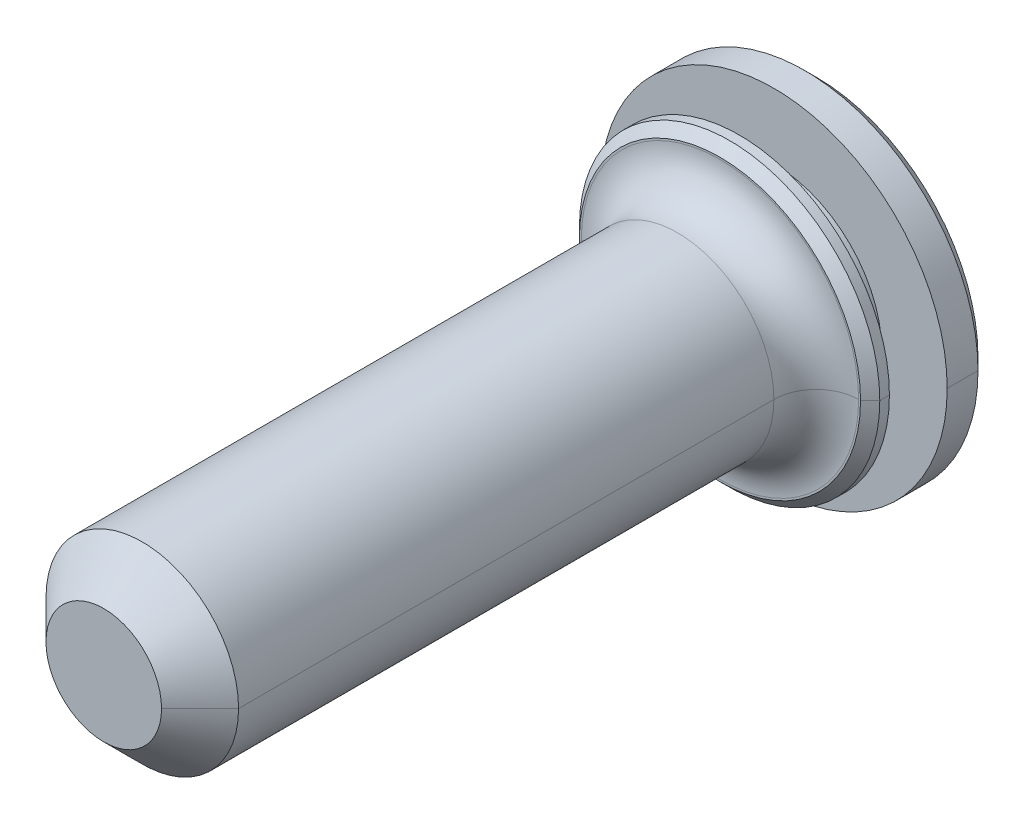
ISO-10303-21;
HEADER;
FILE_DESCRIPTION(('STEP AP214'),'2;1');
FILE_NAME('part.step','',(''),(''),'','','');
FILE_SCHEMA(('AUTOMOTIVE_DESIGN { 1 0 10303 214 1 1 1 1 }'));
ENDSEC;
DATA;
#1=APPLICATION_CONTEXT('core data for automotive mechanical design processes');
#2=APPLICATION_PROTOCOL_DEFINITION('international standard','automotive_design',2000,#1);
#3=PRODUCT_CONTEXT('',#1,'mechanical');
#4=PRODUCT('Part','Part','',(#3));
#5=PRODUCT_RELATED_PRODUCT_CATEGORY('part','',(#4));
#6=PRODUCT_DEFINITION_FORMATION('','',#4);
#7=PRODUCT_DEFINITION_CONTEXT('part definition',#1,'design');
#8=PRODUCT_DEFINITION('design','',#6,#7);
#9=PRODUCT_DEFINITION_SHAPE('','',#8);
#10=(LENGTH_UNIT() NAMED_UNIT(*) SI_UNIT(.MILLI.,.METRE.));
#11=(NAMED_UNIT(*) PLANE_ANGLE_UNIT() SI_UNIT($,.RADIAN.));
#12=(NAMED_UNIT(*) SI_UNIT($,.STERADIAN.) SOLID_ANGLE_UNIT());
#13=UNCERTAINTY_MEASURE_WITH_UNIT(LENGTH_MEASURE(1.E-05),#10,'distance_accuracy_value','');
#14=(GEOMETRIC_REPRESENTATION_CONTEXT(3) GLOBAL_UNCERTAINTY_ASSIGNED_CONTEXT((#13)) GLOBAL_UNIT_ASSIGNED_CONTEXT((#10,
#11,#12)) REPRESENTATION_CONTEXT('',''));
#15=CARTESIAN_POINT('',(0.,0.,0.));
#16=DIRECTION('',(0.,0.,1.));
#17=DIRECTION('',(1.,0.,0.));
#18=AXIS2_PLACEMENT_3D('',#15,#16,#17);
#19=CARTESIAN_POINT('',(-1.5,0.,18.5));
#20=CARTESIAN_POINT('',(-2.5,0.,17.5));
#21=(BOUNDED_CURVE() B_SPLINE_CURVE(1,(#19,#20),.UNSPECIFIED.,.F.,
.F.) B_SPLINE_CURVE_WITH_KNOTS((2,2),(0.,1.),
.UNSPECIFIED.) CURVE() GEOMETRIC_REPRESENTATION_ITEM() RATIONAL_B_SPLINE_CURVE((1.,1.)) REPRESENTATION_ITEM(''));
#22=CARTESIAN_POINT('',(0.,0.,18.5));
#23=DIRECTION('',(0.,0.,-1.));
#24=AXIS1_PLACEMENT('',#22,#23);
#25=SURFACE_OF_REVOLUTION('',#21,#24);
#26=CARTESIAN_POINT('',(0.,0.,17.5));
#27=DIRECTION('',(0.,0.,-1.));
#28=DIRECTION('',(-1.,0.,0.));
#29=AXIS2_PLACEMENT_3D('',#26,#27,#28);
#30=CIRCLE('',#29,2.5);
#31=CARTESIAN_POINT('',(-2.5,0.,17.5));
#32=VERTEX_POINT('',#31);
#33=CARTESIAN_POINT('',(2.5,0.,17.5));
#34=VERTEX_POINT('',#33);
#35=EDGE_CURVE('E224',#32,#34,#30,.T.);
#36=ORIENTED_EDGE('',*,*,#35,.F.);
#37=DIRECTION('',(0.707106781186548,0.,0.707106781186548));
#38=VECTOR('',#37,1.);
#39=CARTESIAN_POINT('',(-2.5,0.,17.5));
#40=LINE('',#39,#38);
#41=CARTESIAN_POINT('',(-1.5,0.,18.5));
#42=VERTEX_POINT('',#41);
#43=EDGE_CURVE('E220',#32,#42,#40,.T.);
#44=ORIENTED_EDGE('',*,*,#43,.T.);
#45=CARTESIAN_POINT('',(0.,0.,18.5));
#46=DIRECTION('',(0.,0.,-1.));
#47=DIRECTION('',(-1.,0.,0.));
#48=AXIS2_PLACEMENT_3D('',#45,#46,#47);
#49=CIRCLE('',#48,1.5);
#50=CARTESIAN_POINT('',(1.5,0.,18.5));
#51=VERTEX_POINT('',#50);
#52=EDGE_CURVE('E28',#42,#51,#49,.T.);
#53=ORIENTED_EDGE('',*,*,#52,.T.);
#54=DIRECTION('',(0.707106781186548,0.,-0.707106781186548));
#55=VECTOR('',#54,1.);
#56=CARTESIAN_POINT('',(1.5,0.,18.5));
#57=LINE('',#56,#55);
#58=EDGE_CURVE('E215',#51,#34,#57,.T.);
#59=ORIENTED_EDGE('',*,*,#58,.T.);
#60=EDGE_LOOP('',(#36,#44,#53,#59));
#61=FACE_BOUND('',#60,.T.);
#62=ADVANCED_FACE('F17',(#61),#25,.T.);
#63=CARTESIAN_POINT('',(2.5,0.,17.5));
#64=CARTESIAN_POINT('',(2.5,0.,3.6));
#65=(BOUNDED_CURVE() B_SPLINE_CURVE(1,(#63,#64),.UNSPECIFIED.,.F.,
.F.) B_SPLINE_CURVE_WITH_KNOTS((2,2),(0.,1.),
.UNSPECIFIED.) CURVE() GEOMETRIC_REPRESENTATION_ITEM() RATIONAL_B_SPLINE_CURVE((1.,1.)) REPRESENTATION_ITEM(''));
#66=CARTESIAN_POINT('',(0.,0.,17.5));
#67=DIRECTION('',(0.,0.,-1.));
#68=AXIS1_PLACEMENT('',#66,#67);
#69=SURFACE_OF_REVOLUTION('',#65,#68);
#70=CARTESIAN_POINT('',(0.,0.,17.5));
#71=DIRECTION('',(0.,0.,-1.));
#72=DIRECTION('',(1.,0.,0.));
#73=AXIS2_PLACEMENT_3D('',#70,#71,#72);
#74=CIRCLE('',#73,2.5);
#75=EDGE_CURVE('E223',#34,#32,#74,.T.);
#76=ORIENTED_EDGE('',*,*,#75,.T.);
#77=DIRECTION('',(0.,0.,1.));
#78=VECTOR('',#77,1.);
#79=CARTESIAN_POINT('',(-2.5,0.,3.6));
#80=LINE('',#79,#78);
#81=CARTESIAN_POINT('',(-2.5,0.,3.6));
#82=VERTEX_POINT('',#81);
#83=EDGE_CURVE('E183',#82,#32,#80,.T.);
#84=ORIENTED_EDGE('',*,*,#83,.F.);
#85=CARTESIAN_POINT('',(0.,0.,3.6));
#86=DIRECTION('',(0.,0.,-1.));
#87=DIRECTION('',(1.,0.,0.));
#88=AXIS2_PLACEMENT_3D('',#85,#86,#87);
#89=CIRCLE('',#88,2.5);
#90=CARTESIAN_POINT('',(2.5,0.,3.6));
#91=VERTEX_POINT('',#90);
#92=EDGE_CURVE('E121',#91,#82,#89,.T.);
#93=ORIENTED_EDGE('',*,*,#92,.F.);
#94=DIRECTION('',(0.,0.,-1.));
#95=VECTOR('',#94,1.);
#96=CARTESIAN_POINT('',(2.5,0.,17.5));
#97=LINE('',#96,#95);
#98=EDGE_CURVE('E184',#34,#91,#97,.T.);
#99=ORIENTED_EDGE('',*,*,#98,.F.);
#100=EDGE_LOOP('',(#76,#84,#93,#99));
#101=FACE_BOUND('',#100,.T.);
#102=ADVANCED_FACE('F325',(#101),#69,.T.);
#103=CARTESIAN_POINT('',(0.,0.,3.6));
#104=DIRECTION('',(0.,0.,-1.));
#105=DIRECTION('',(-1.,0.,0.));
#106=AXIS2_PLACEMENT_3D('',#103,#104,#105);
#107=TOROIDAL_SURFACE('',#106,3.6,1.1);
#108=CARTESIAN_POINT('',(0.,0.,2.5));
#109=DIRECTION('',(0.,0.,-1.));
#110=DIRECTION('',(-1.,0.,0.));
#111=AXIS2_PLACEMENT_3D('',#108,#109,#110);
#112=CIRCLE('',#111,3.6);
#113=CARTESIAN_POINT('',(-3.6,0.,2.5));
#114=VERTEX_POINT('',#113);
#115=CARTESIAN_POINT('',(3.6,0.,2.5));
#116=VERTEX_POINT('',#115);
#117=EDGE_CURVE('E116',#114,#116,#112,.T.);
#118=ORIENTED_EDGE('',*,*,#117,.F.);
#119=CARTESIAN_POINT('',(-3.6,0.,3.6));
#120=DIRECTION('',(0.,-1.,0.));
#121=DIRECTION('',(0.,0.,-1.));
#122=AXIS2_PLACEMENT_3D('',#119,#120,#121);
#123=CIRCLE('',#122,1.1);
#124=EDGE_CURVE('E107',#114,#82,#123,.T.);
#125=ORIENTED_EDGE('',*,*,#124,.T.);
#126=CARTESIAN_POINT('',(0.,0.,3.6));
#127=DIRECTION('',(0.,0.,-1.));
#128=DIRECTION('',(-1.,0.,0.));
#129=AXIS2_PLACEMENT_3D('',#126,#127,#128);
#130=CIRCLE('',#129,2.5);
#131=EDGE_CURVE('E118',#82,#91,#130,.T.);
#132=ORIENTED_EDGE('',*,*,#131,.T.);
#133=CARTESIAN_POINT('',(3.6,0.,3.6));
#134=DIRECTION('',(0.,-1.,0.));
#135=DIRECTION('',(-1.,0.,0.));
#136=AXIS2_PLACEMENT_3D('',#133,#134,#135);
#137=CIRCLE('',#136,1.1);
#138=EDGE_CURVE('E113',#91,#116,#137,.T.);
#139=ORIENTED_EDGE('',*,*,#138,.T.);
#140=EDGE_LOOP('',(#118,#125,#132,#139));
#141=FACE_BOUND('',#140,.T.);
#142=ADVANCED_FACE('F114',(#141),#107,.F.);
#143=CARTESIAN_POINT('',(-3.65,0.,2.5));
#144=CARTESIAN_POINT('',(-3.9,0.,2.25));
#145=(BOUNDED_CURVE() B_SPLINE_CURVE(1,(#143,#144),.UNSPECIFIED.,.F.,
.F.) B_SPLINE_CURVE_WITH_KNOTS((2,2),(0.,1.),
.UNSPECIFIED.) CURVE() GEOMETRIC_REPRESENTATION_ITEM() RATIONAL_B_SPLINE_CURVE((1.,1.)) REPRESENTATION_ITEM(''));
#146=CARTESIAN_POINT('',(0.,0.,2.5));
#147=DIRECTION('',(0.,0.,-1.));
#148=AXIS1_PLACEMENT('',#146,#147);
#149=SURFACE_OF_REVOLUTION('',#145,#148);
#150=CARTESIAN_POINT('',(0.,0.,2.25));
#151=DIRECTION('',(0.,0.,-1.));
#152=DIRECTION('',(-1.,0.,0.));
#153=AXIS2_PLACEMENT_3D('',#150,#151,#152);
#154=CIRCLE('',#153,3.9);
#155=CARTESIAN_POINT('',(-3.9,0.,2.25));
#156=VERTEX_POINT('',#155);
#157=CARTESIAN_POINT('',(3.9,0.,2.25));
#158=VERTEX_POINT('',#157);
#159=EDGE_CURVE('E211',#156,#158,#154,.T.);
#160=ORIENTED_EDGE('',*,*,#159,.F.);
#161=DIRECTION('',(0.707106781186548,0.,0.707106781186548));
#162=VECTOR('',#161,1.);
#163=CARTESIAN_POINT('',(-3.9,0.,2.25));
#164=LINE('',#163,#162);
#165=CARTESIAN_POINT('',(-3.65,0.,2.5));
#166=VERTEX_POINT('',#165);
#167=EDGE_CURVE('E180',#156,#166,#164,.T.);
#168=ORIENTED_EDGE('',*,*,#167,.T.);
#169=CARTESIAN_POINT('',(0.,0.,2.5));
#170=DIRECTION('',(0.,0.,-1.));
#171=DIRECTION('',(-1.,0.,0.));
#172=AXIS2_PLACEMENT_3D('',#169,#170,#171);
#173=CIRCLE('',#172,3.65);
#174=CARTESIAN_POINT('',(3.65,0.,2.5));
#175=VERTEX_POINT('',#174);
#176=EDGE_CURVE('E131',#166,#175,#173,.T.);
#177=ORIENTED_EDGE('',*,*,#176,.T.);
#178=DIRECTION('',(0.707106781186548,0.,-0.707106781186548));
#179=VECTOR('',#178,1.);
#180=CARTESIAN_POINT('',(3.65,0.,2.5));
#181=LINE('',#180,#179);
#182=EDGE_CURVE('E144',#175,#158,#181,.T.);
#183=ORIENTED_EDGE('',*,*,#182,.T.);
#184=EDGE_LOOP('',(#160,#168,#177,#183));
#185=FACE_BOUND('',#184,.T.);
#186=ADVANCED_FACE('F383',(#185),#149,.T.);
#187=CARTESIAN_POINT('',(3.9,0.,2.25));
#188=CARTESIAN_POINT('',(3.9,0.,2.));
#189=(BOUNDED_CURVE() B_SPLINE_CURVE(1,(#187,#188),.UNSPECIFIED.,.F.,
.F.) B_SPLINE_CURVE_WITH_KNOTS((2,2),(0.,1.),
.UNSPECIFIED.) CURVE() GEOMETRIC_REPRESENTATION_ITEM() RATIONAL_B_SPLINE_CURVE((1.,1.)) REPRESENTATION_ITEM(''));
#190=CARTESIAN_POINT('',(0.,0.,2.25));
#191=DIRECTION('',(0.,0.,-1.));
#192=AXIS1_PLACEMENT('',#190,#191);
#193=SURFACE_OF_REVOLUTION('',#189,#192);
#194=CARTESIAN_POINT('',(0.,0.,2.25));
#195=DIRECTION('',(0.,0.,-1.));
#196=DIRECTION('',(1.,0.,0.));
#197=AXIS2_PLACEMENT_3D('',#194,#195,#196);
#198=CIRCLE('',#197,3.9);
#199=EDGE_CURVE('E140',#158,#156,#198,.T.);
#200=ORIENTED_EDGE('',*,*,#199,.T.);
#201=DIRECTION('',(0.,0.,1.));
#202=VECTOR('',#201,1.);
#203=CARTESIAN_POINT('',(-3.9,0.,2.));
#204=LINE('',#203,#202);
#205=CARTESIAN_POINT('',(-3.9,0.,2.));
#206=VERTEX_POINT('',#205);
#207=EDGE_CURVE('E198',#206,#156,#204,.T.);
#208=ORIENTED_EDGE('',*,*,#207,.F.);
#209=CARTESIAN_POINT('',(0.,0.,2.));
#210=DIRECTION('',(0.,0.,-1.));
#211=DIRECTION('',(1.,0.,0.));
#212=AXIS2_PLACEMENT_3D('',#209,#210,#211);
#213=CIRCLE('',#212,3.9);
#214=CARTESIAN_POINT('',(3.9,0.,2.));
#215=VERTEX_POINT('',#214);
#216=EDGE_CURVE('E146',#215,#206,#213,.T.);
#217=ORIENTED_EDGE('',*,*,#216,.F.);
#218=DIRECTION('',(0.,0.,-1.));
#219=VECTOR('',#218,1.);
#220=CARTESIAN_POINT('',(3.9,0.,2.25));
#221=LINE('',#220,#219);
#222=EDGE_CURVE('E193',#158,#215,#221,.T.);
#223=ORIENTED_EDGE('',*,*,#222,.F.);
#224=EDGE_LOOP('',(#200,#208,#217,#223));
#225=FACE_BOUND('',#224,.T.);
#226=ADVANCED_FACE('F379',(#225),#193,.T.);
#227=CARTESIAN_POINT('',(2.8,0.,2.));
#228=CARTESIAN_POINT('',(2.8,0.,1.1));
#229=(BOUNDED_CURVE() B_SPLINE_CURVE(1,(#227,#228),.UNSPECIFIED.,.F.,
.F.) B_SPLINE_CURVE_WITH_KNOTS((2,2),(0.,1.),
.UNSPECIFIED.) CURVE() GEOMETRIC_REPRESENTATION_ITEM() RATIONAL_B_SPLINE_CURVE((1.,1.)) REPRESENTATION_ITEM(''));
#230=CARTESIAN_POINT('',(0.,0.,2.));
#231=DIRECTION('',(0.,0.,-1.));
#232=AXIS1_PLACEMENT('',#230,#231);
#233=SURFACE_OF_REVOLUTION('',#229,#232);
#234=CARTESIAN_POINT('',(0.,0.,2.));
#235=DIRECTION('',(0.,0.,-1.));
#236=DIRECTION('',(1.,0.,0.));
#237=AXIS2_PLACEMENT_3D('',#234,#235,#236);
#238=CIRCLE('',#237,2.8);
#239=CARTESIAN_POINT('',(2.8,0.,2.));
#240=VERTEX_POINT('',#239);
#241=CARTESIAN_POINT('',(-2.8,0.,2.));
#242=VERTEX_POINT('',#241);
#243=EDGE_CURVE('E148',#240,#242,#238,.T.);
#244=ORIENTED_EDGE('',*,*,#243,.T.);
#245=DIRECTION('',(0.,0.,1.));
#246=VECTOR('',#245,1.);
#247=CARTESIAN_POINT('',(-2.8,0.,1.1));
#248=LINE('',#247,#246);
#249=CARTESIAN_POINT('',(-2.8,0.,1.1));
#250=VERTEX_POINT('',#249);
#251=EDGE_CURVE('E90',#250,#242,#248,.T.);
#252=ORIENTED_EDGE('',*,*,#251,.F.);
#253=CARTESIAN_POINT('',(0.,0.,1.1));
#254=DIRECTION('',(0.,0.,-1.));
#255=DIRECTION('',(1.,0.,0.));
#256=AXIS2_PLACEMENT_3D('',#253,#254,#255);
#257=CIRCLE('',#256,2.8);
#258=CARTESIAN_POINT('',(2.8,0.,1.1));
#259=VERTEX_POINT('',#258);
#260=EDGE_CURVE('E245',#259,#250,#257,.T.);
#261=ORIENTED_EDGE('',*,*,#260,.F.);
#262=DIRECTION('',(0.,0.,-1.));
#263=VECTOR('',#262,1.);
#264=CARTESIAN_POINT('',(2.8,0.,2.));
#265=LINE('',#264,#263);
#266=EDGE_CURVE('E82',#240,#259,#265,.T.);
#267=ORIENTED_EDGE('',*,*,#266,.F.);
#268=EDGE_LOOP('',(#244,#252,#261,#267));
#269=FACE_BOUND('',#268,.T.);
#270=ADVANCED_FACE('F285',(#269),#233,.T.);
#271=CARTESIAN_POINT('',(4.5,0.,1.1));
#272=CARTESIAN_POINT('',(4.5,0.,0.3));
#273=(BOUNDED_CURVE() B_SPLINE_CURVE(1,(#271,#272),.UNSPECIFIED.,.F.,
.F.) B_SPLINE_CURVE_WITH_KNOTS((2,2),(0.,1.),
.UNSPECIFIED.) CURVE() GEOMETRIC_REPRESENTATION_ITEM() RATIONAL_B_SPLINE_CURVE((1.,1.)) REPRESENTATION_ITEM(''));
#274=CARTESIAN_POINT('',(0.,0.,1.1));
#275=DIRECTION('',(0.,0.,-1.));
#276=AXIS1_PLACEMENT('',#274,#275);
#277=SURFACE_OF_REVOLUTION('',#273,#276);
#278=CARTESIAN_POINT('',(0.,0.,1.1));
#279=DIRECTION('',(0.,0.,-1.));
#280=DIRECTION('',(1.,0.,0.));
#281=AXIS2_PLACEMENT_3D('',#278,#279,#280);
#282=CIRCLE('',#281,4.5);
#283=CARTESIAN_POINT('',(4.5,0.,1.1));
#284=VERTEX_POINT('',#283);
#285=CARTESIAN_POINT('',(-4.5,0.,1.1));
#286=VERTEX_POINT('',#285);
#287=EDGE_CURVE('E163',#284,#286,#282,.T.);
#288=ORIENTED_EDGE('',*,*,#287,.T.);
#289=DIRECTION('',(0.,0.,1.));
#290=VECTOR('',#289,1.);
#291=CARTESIAN_POINT('',(-4.5,0.,0.3));
#292=LINE('',#291,#290);
#293=CARTESIAN_POINT('',(-4.5,0.,0.3));
#294=VERTEX_POINT('',#293);
#295=EDGE_CURVE('E150',#294,#286,#292,.T.);
#296=ORIENTED_EDGE('',*,*,#295,.F.);
#297=CARTESIAN_POINT('',(0.,0.,0.3));
#298=DIRECTION('',(0.,0.,-1.));
#299=DIRECTION('',(1.,0.,0.));
#300=AXIS2_PLACEMENT_3D('',#297,#298,#299);
#301=CIRCLE('',#300,4.5);
#302=CARTESIAN_POINT('',(4.5,0.,0.3));
#303=VERTEX_POINT('',#302);
#304=EDGE_CURVE('E11',#303,#294,#301,.T.);
#305=ORIENTED_EDGE('',*,*,#304,.F.);
#306=DIRECTION('',(0.,0.,-1.));
#307=VECTOR('',#306,1.);
#308=CARTESIAN_POINT('',(4.5,0.,1.1));
#309=LINE('',#308,#307);
#310=EDGE_CURVE('E154',#284,#303,#309,.T.);
#311=ORIENTED_EDGE('',*,*,#310,.F.);
#312=EDGE_LOOP('',(#288,#296,#305,#311));
#313=FACE_BOUND('',#312,.T.);
#314=ADVANCED_FACE('F291',(#313),#277,.T.);
#315=CARTESIAN_POINT('',(4.5,0.,0.3));
#316=CARTESIAN_POINT('',(4.2,0.,0.));
#317=(BOUNDED_CURVE() B_SPLINE_CURVE(1,(#315,#316),.UNSPECIFIED.,.F.,
.F.) B_SPLINE_CURVE_WITH_KNOTS((2,2),(0.,1.),
.UNSPECIFIED.) CURVE() GEOMETRIC_REPRESENTATION_ITEM() RATIONAL_B_SPLINE_CURVE((1.,1.)) REPRESENTATION_ITEM(''));
#318=CARTESIAN_POINT('',(0.,0.,0.3));
#319=DIRECTION('',(0.,0.,-1.));
#320=AXIS1_PLACEMENT('',#318,#319);
#321=SURFACE_OF_REVOLUTION('',#317,#320);
#322=ORIENTED_EDGE('',*,*,#304,.T.);
#323=DIRECTION('',(-0.707106781186547,0.,0.707106781186548));
#324=VECTOR('',#323,1.);
#325=CARTESIAN_POINT('',(-4.2,0.,0.));
#326=LINE('',#325,#324);
#327=CARTESIAN_POINT('',(-4.2,0.,0.));
#328=VERTEX_POINT('',#327);
#329=EDGE_CURVE('E176',#328,#294,#326,.T.);
#330=ORIENTED_EDGE('',*,*,#329,.F.);
#331=CARTESIAN_POINT('',(0.,0.,0.));
#332=DIRECTION('',(0.,0.,-1.));
#333=DIRECTION('',(1.,0.,0.));
#334=AXIS2_PLACEMENT_3D('',#331,#332,#333);
#335=CIRCLE('',#334,4.2);
#336=CARTESIAN_POINT('',(4.2,0.,0.));
#337=VERTEX_POINT('',#336);
#338=EDGE_CURVE('E232',#337,#328,#335,.T.);
#339=ORIENTED_EDGE('',*,*,#338,.F.);
#340=DIRECTION('',(-0.707106781186547,0.,-0.707106781186548));
#341=VECTOR('',#340,1.);
#342=CARTESIAN_POINT('',(4.5,0.,0.3));
#343=LINE('',#342,#341);
#344=EDGE_CURVE('E21',#303,#337,#343,.T.);
#345=ORIENTED_EDGE('',*,*,#344,.F.);
#346=EDGE_LOOP('',(#322,#330,#339,#345));
#347=FACE_BOUND('',#346,.T.);
#348=ADVANCED_FACE('F294',(#347),#321,.T.);
#349=CARTESIAN_POINT('',(1.5,1.5,18.5));
#350=DIRECTION('',(0.,0.,1.));
#351=DIRECTION('',(-1.,0.,0.));
#352=AXIS2_PLACEMENT_3D('',#349,#350,#351);
#353=PLANE('',#352);
#354=CARTESIAN_POINT('',(0.,0.,18.5));
#355=DIRECTION('',(0.,0.,-1.));
#356=DIRECTION('',(1.,0.,0.));
#357=AXIS2_PLACEMENT_3D('',#354,#355,#356);
#358=CIRCLE('',#357,1.5);
#359=EDGE_CURVE('E217',#51,#42,#358,.T.);
#360=ORIENTED_EDGE('',*,*,#359,.F.);
#361=ORIENTED_EDGE('',*,*,#52,.F.);
#362=EDGE_LOOP('',(#360,#361));
#363=FACE_BOUND('',#362,.T.);
#364=ADVANCED_FACE('F345',(#363),#353,.T.);
#365=CARTESIAN_POINT('',(1.5,0.,18.5));
#366=CARTESIAN_POINT('',(2.5,0.,17.5));
#367=(BOUNDED_CURVE() B_SPLINE_CURVE(1,(#365,#366),.UNSPECIFIED.,.F.,
.F.) B_SPLINE_CURVE_WITH_KNOTS((2,2),(0.,1.),
.UNSPECIFIED.) CURVE() GEOMETRIC_REPRESENTATION_ITEM() RATIONAL_B_SPLINE_CURVE((1.,1.)) REPRESENTATION_ITEM(''));
#368=CARTESIAN_POINT('',(0.,0.,18.5));
#369=DIRECTION('',(0.,0.,-1.));
#370=AXIS1_PLACEMENT('',#368,#369);
#371=SURFACE_OF_REVOLUTION('',#367,#370);
#372=ORIENTED_EDGE('',*,*,#58,.F.);
#373=ORIENTED_EDGE('',*,*,#359,.T.);
#374=ORIENTED_EDGE('',*,*,#43,.F.);
#375=ORIENTED_EDGE('',*,*,#75,.F.);
#376=EDGE_LOOP('',(#372,#373,#374,#375));
#377=FACE_BOUND('',#376,.T.);
#378=ADVANCED_FACE('F349',(#377),#371,.T.);
#379=CARTESIAN_POINT('',(-2.5,0.,17.5));
#380=CARTESIAN_POINT('',(-2.5,0.,3.6));
#381=(BOUNDED_CURVE() B_SPLINE_CURVE(1,(#379,#380),.UNSPECIFIED.,.F.,
.F.) B_SPLINE_CURVE_WITH_KNOTS((2,2),(0.,1.),
.UNSPECIFIED.) CURVE() GEOMETRIC_REPRESENTATION_ITEM() RATIONAL_B_SPLINE_CURVE((1.,1.)) REPRESENTATION_ITEM(''));
#382=CARTESIAN_POINT('',(0.,0.,17.5));
#383=DIRECTION('',(0.,0.,-1.));
#384=AXIS1_PLACEMENT('',#382,#383);
#385=SURFACE_OF_REVOLUTION('',#381,#384);
#386=ORIENTED_EDGE('',*,*,#98,.T.);
#387=ORIENTED_EDGE('',*,*,#131,.F.);
#388=ORIENTED_EDGE('',*,*,#83,.T.);
#389=ORIENTED_EDGE('',*,*,#35,.T.);
#390=EDGE_LOOP('',(#386,#387,#388,#389));
#391=FACE_BOUND('',#390,.T.);
#392=ADVANCED_FACE('F312',(#391),#385,.T.);
#393=CARTESIAN_POINT('',(0.,0.,3.6));
#394=DIRECTION('',(0.,0.,-1.));
#395=DIRECTION('',(1.,0.,0.));
#396=AXIS2_PLACEMENT_3D('',#393,#394,#395);
#397=TOROIDAL_SURFACE('',#396,3.6,1.1);
#398=ORIENTED_EDGE('',*,*,#138,.F.);
#399=ORIENTED_EDGE('',*,*,#92,.T.);
#400=ORIENTED_EDGE('',*,*,#124,.F.);
#401=CARTESIAN_POINT('',(0.,0.,2.5));
#402=DIRECTION('',(0.,0.,-1.));
#403=DIRECTION('',(1.,0.,0.));
#404=AXIS2_PLACEMENT_3D('',#401,#402,#403);
#405=CIRCLE('',#404,3.6);
#406=EDGE_CURVE('E122',#116,#114,#405,.T.);
#407=ORIENTED_EDGE('',*,*,#406,.F.);
#408=EDGE_LOOP('',(#398,#399,#400,#407));
#409=FACE_BOUND('',#408,.T.);
#410=ADVANCED_FACE('F124',(#409),#397,.F.);
#411=CARTESIAN_POINT('',(3.65,3.65,2.5));
#412=DIRECTION('',(0.,0.,1.));
#413=DIRECTION('',(-1.,0.,0.));
#414=AXIS2_PLACEMENT_3D('',#411,#412,#413);
#415=PLANE('',#414);
#416=ORIENTED_EDGE('',*,*,#117,.T.);
#417=ORIENTED_EDGE('',*,*,#406,.T.);
#418=EDGE_LOOP('',(#416,#417));
#419=FACE_BOUND('',#418,.T.);
#420=CARTESIAN_POINT('',(0.,0.,2.5));
#421=DIRECTION('',(0.,0.,-1.));
#422=DIRECTION('',(1.,0.,0.));
#423=AXIS2_PLACEMENT_3D('',#420,#421,#422);
#424=CIRCLE('',#423,3.65);
#425=EDGE_CURVE('E185',#175,#166,#424,.T.);
#426=ORIENTED_EDGE('',*,*,#425,.F.);
#427=ORIENTED_EDGE('',*,*,#176,.F.);
#428=EDGE_LOOP('',(#426,#427));
#429=FACE_BOUND('',#428,.T.);
#430=ADVANCED_FACE('F128',(#419,#429),#415,.T.);
#431=CARTESIAN_POINT('',(3.65,0.,2.5));
#432=CARTESIAN_POINT('',(3.9,0.,2.25));
#433=(BOUNDED_CURVE() B_SPLINE_CURVE(1,(#431,#432),.UNSPECIFIED.,.F.,
.F.) B_SPLINE_CURVE_WITH_KNOTS((2,2),(0.,1.),
.UNSPECIFIED.) CURVE() GEOMETRIC_REPRESENTATION_ITEM() RATIONAL_B_SPLINE_CURVE((1.,1.)) REPRESENTATION_ITEM(''));
#434=CARTESIAN_POINT('',(0.,0.,2.5));
#435=DIRECTION('',(0.,0.,-1.));
#436=AXIS1_PLACEMENT('',#434,#435);
#437=SURFACE_OF_REVOLUTION('',#433,#436);
#438=ORIENTED_EDGE('',*,*,#182,.F.);
#439=ORIENTED_EDGE('',*,*,#425,.T.);
#440=ORIENTED_EDGE('',*,*,#167,.F.);
#441=ORIENTED_EDGE('',*,*,#199,.F.);
#442=EDGE_LOOP('',(#438,#439,#440,#441));
#443=FACE_BOUND('',#442,.T.);
#444=ADVANCED_FACE('F392',(#443),#437,.T.);
#445=CARTESIAN_POINT('',(-3.9,0.,2.25));
#446=CARTESIAN_POINT('',(-3.9,0.,2.));
#447=(BOUNDED_CURVE() B_SPLINE_CURVE(1,(#445,#446),.UNSPECIFIED.,.F.,
.F.) B_SPLINE_CURVE_WITH_KNOTS((2,2),(0.,1.),
.UNSPECIFIED.) CURVE() GEOMETRIC_REPRESENTATION_ITEM() RATIONAL_B_SPLINE_CURVE((1.,1.)) REPRESENTATION_ITEM(''));
#448=CARTESIAN_POINT('',(0.,0.,2.25));
#449=DIRECTION('',(0.,0.,-1.));
#450=AXIS1_PLACEMENT('',#448,#449);
#451=SURFACE_OF_REVOLUTION('',#447,#450);
#452=ORIENTED_EDGE('',*,*,#222,.T.);
#453=CARTESIAN_POINT('',(0.,0.,2.));
#454=DIRECTION('',(0.,0.,-1.));
#455=DIRECTION('',(-1.,0.,0.));
#456=AXIS2_PLACEMENT_3D('',#453,#454,#455);
#457=CIRCLE('',#456,3.9);
#458=EDGE_CURVE('E149',#206,#215,#457,.T.);
#459=ORIENTED_EDGE('',*,*,#458,.F.);
#460=ORIENTED_EDGE('',*,*,#207,.T.);
#461=ORIENTED_EDGE('',*,*,#159,.T.);
#462=EDGE_LOOP('',(#452,#459,#460,#461));
#463=FACE_BOUND('',#462,.T.);
#464=ADVANCED_FACE('F371',(#463),#451,.T.);
#465=CARTESIAN_POINT('',(3.9,-3.9,2.));
#466=DIRECTION('',(0.,0.,-1.));
#467=DIRECTION('',(-1.,0.,0.));
#468=AXIS2_PLACEMENT_3D('',#465,#466,#467);
#469=PLANE('',#468);
#470=ORIENTED_EDGE('',*,*,#243,.F.);
#471=CARTESIAN_POINT('',(0.,0.,2.));
#472=DIRECTION('',(0.,0.,-1.));
#473=DIRECTION('',(-1.,0.,0.));
#474=AXIS2_PLACEMENT_3D('',#471,#472,#473);
#475=CIRCLE('',#474,2.8);
#476=EDGE_CURVE('E191',#242,#240,#475,.T.);
#477=ORIENTED_EDGE('',*,*,#476,.F.);
#478=EDGE_LOOP('',(#470,#477));
#479=FACE_BOUND('',#478,.T.);
#480=ORIENTED_EDGE('',*,*,#458,.T.);
#481=ORIENTED_EDGE('',*,*,#216,.T.);
#482=EDGE_LOOP('',(#480,#481));
#483=FACE_BOUND('',#482,.T.);
#484=ADVANCED_FACE('F337',(#479,#483),#469,.T.);
#485=CARTESIAN_POINT('',(-2.8,0.,2.));
#486=CARTESIAN_POINT('',(-2.8,0.,1.1));
#487=(BOUNDED_CURVE() B_SPLINE_CURVE(1,(#485,#486),.UNSPECIFIED.,.F.,
.F.) B_SPLINE_CURVE_WITH_KNOTS((2,2),(0.,1.),
.UNSPECIFIED.) CURVE() GEOMETRIC_REPRESENTATION_ITEM() RATIONAL_B_SPLINE_CURVE((1.,1.)) REPRESENTATION_ITEM(''));
#488=CARTESIAN_POINT('',(0.,0.,2.));
#489=DIRECTION('',(0.,0.,-1.));
#490=AXIS1_PLACEMENT('',#488,#489);
#491=SURFACE_OF_REVOLUTION('',#487,#490);
#492=ORIENTED_EDGE('',*,*,#266,.T.);
#493=CARTESIAN_POINT('',(0.,0.,1.1));
#494=DIRECTION('',(0.,0.,-1.));
#495=DIRECTION('',(-1.,0.,0.));
#496=AXIS2_PLACEMENT_3D('',#493,#494,#495);
#497=CIRCLE('',#496,2.8);
#498=EDGE_CURVE('E237',#250,#259,#497,.T.);
#499=ORIENTED_EDGE('',*,*,#498,.F.);
#500=ORIENTED_EDGE('',*,*,#251,.T.);
#501=ORIENTED_EDGE('',*,*,#476,.T.);
#502=EDGE_LOOP('',(#492,#499,#500,#501));
#503=FACE_BOUND('',#502,.T.);
#504=ADVANCED_FACE('F283',(#503),#491,.T.);
#505=CARTESIAN_POINT('',(4.5,4.5,1.1));
#506=DIRECTION('',(0.,0.,1.));
#507=DIRECTION('',(-1.,0.,0.));
#508=AXIS2_PLACEMENT_3D('',#505,#506,#507);
#509=PLANE('',#508);
#510=ORIENTED_EDGE('',*,*,#498,.T.);
#511=ORIENTED_EDGE('',*,*,#260,.T.);
#512=EDGE_LOOP('',(#510,#511));
#513=FACE_BOUND('',#512,.T.);
#514=ORIENTED_EDGE('',*,*,#287,.F.);
#515=CARTESIAN_POINT('',(0.,0.,1.1));
#516=DIRECTION('',(0.,0.,-1.));
#517=DIRECTION('',(-1.,0.,0.));
#518=AXIS2_PLACEMENT_3D('',#515,#516,#517);
#519=CIRCLE('',#518,4.5);
#520=EDGE_CURVE('E153',#286,#284,#519,.T.);
#521=ORIENTED_EDGE('',*,*,#520,.F.);
#522=EDGE_LOOP('',(#514,#521));
#523=FACE_BOUND('',#522,.T.);
#524=ADVANCED_FACE('F286',(#513,#523),#509,.T.);
#525=CARTESIAN_POINT('',(-4.5,0.,1.1));
#526=CARTESIAN_POINT('',(-4.5,0.,0.3));
#527=(BOUNDED_CURVE() B_SPLINE_CURVE(1,(#525,#526),.UNSPECIFIED.,.F.,
.F.) B_SPLINE_CURVE_WITH_KNOTS((2,2),(0.,1.),
.UNSPECIFIED.) CURVE() GEOMETRIC_REPRESENTATION_ITEM() RATIONAL_B_SPLINE_CURVE((1.,1.)) REPRESENTATION_ITEM(''));
#528=CARTESIAN_POINT('',(0.,0.,1.1));
#529=DIRECTION('',(0.,0.,-1.));
#530=AXIS1_PLACEMENT('',#528,#529);
#531=SURFACE_OF_REVOLUTION('',#527,#530);
#532=ORIENTED_EDGE('',*,*,#310,.T.);
#533=CARTESIAN_POINT('',(0.,0.,0.3));
#534=DIRECTION('',(0.,0.,-1.));
#535=DIRECTION('',(-1.,0.,0.));
#536=AXIS2_PLACEMENT_3D('',#533,#534,#535);
#537=CIRCLE('',#536,4.5);
#538=EDGE_CURVE('E167',#294,#303,#537,.T.);
#539=ORIENTED_EDGE('',*,*,#538,.F.);
#540=ORIENTED_EDGE('',*,*,#295,.T.);
#541=ORIENTED_EDGE('',*,*,#520,.T.);
#542=EDGE_LOOP('',(#532,#539,#540,#541));
#543=FACE_BOUND('',#542,.T.);
#544=ADVANCED_FACE('F289',(#543),#531,.T.);
#545=CARTESIAN_POINT('',(-4.5,0.,0.3));
#546=CARTESIAN_POINT('',(-4.2,0.,0.));
#547=(BOUNDED_CURVE() B_SPLINE_CURVE(1,(#545,#546),.UNSPECIFIED.,.F.,
.F.) B_SPLINE_CURVE_WITH_KNOTS((2,2),(0.,1.),
.UNSPECIFIED.) CURVE() GEOMETRIC_REPRESENTATION_ITEM() RATIONAL_B_SPLINE_CURVE((1.,1.)) REPRESENTATION_ITEM(''));
#548=CARTESIAN_POINT('',(0.,0.,0.3));
#549=DIRECTION('',(0.,0.,-1.));
#550=AXIS1_PLACEMENT('',#548,#549);
#551=SURFACE_OF_REVOLUTION('',#547,#550);
#552=ORIENTED_EDGE('',*,*,#344,.T.);
#553=CARTESIAN_POINT('',(0.,0.,0.));
#554=DIRECTION('',(0.,0.,-1.));
#555=DIRECTION('',(-1.,0.,0.));
#556=AXIS2_PLACEMENT_3D('',#553,#554,#555);
#557=CIRCLE('',#556,4.2);
#558=EDGE_CURVE('E235',#328,#337,#557,.T.);
#559=ORIENTED_EDGE('',*,*,#558,.F.);
#560=ORIENTED_EDGE('',*,*,#329,.T.);
#561=ORIENTED_EDGE('',*,*,#538,.T.);
#562=EDGE_LOOP('',(#552,#559,#560,#561));
#563=FACE_BOUND('',#562,.T.);
#564=ADVANCED_FACE('F357',(#563),#551,.T.);
#565=CARTESIAN_POINT('',(4.2,-4.2,0.));
#566=DIRECTION('',(0.,0.,-1.));
#567=DIRECTION('',(-1.,0.,0.));
#568=AXIS2_PLACEMENT_3D('',#565,#566,#567);
#569=PLANE('',#568);
#570=ORIENTED_EDGE('',*,*,#558,.T.);
#571=ORIENTED_EDGE('',*,*,#338,.T.);
#572=EDGE_LOOP('',(#570,#571));
#573=FACE_BOUND('',#572,.T.);
#574=ADVANCED_FACE('F19',(#573),#569,.T.);
#575=CLOSED_SHELL('',(#62,#102,#142,#186,#226,#270,#314,#348,#364,#378,#392,#410,#430,#444,#464,
#484,#504,#524,#544,#564,#574));
#576=MANIFOLD_SOLID_BREP('B1',#575);
#577=ADVANCED_BREP_SHAPE_REPRESENTATION('',(#18,#576),#14);
#578=SHAPE_DEFINITION_REPRESENTATION(#9,#577);
ENDSEC;
END-ISO-10303-21;
